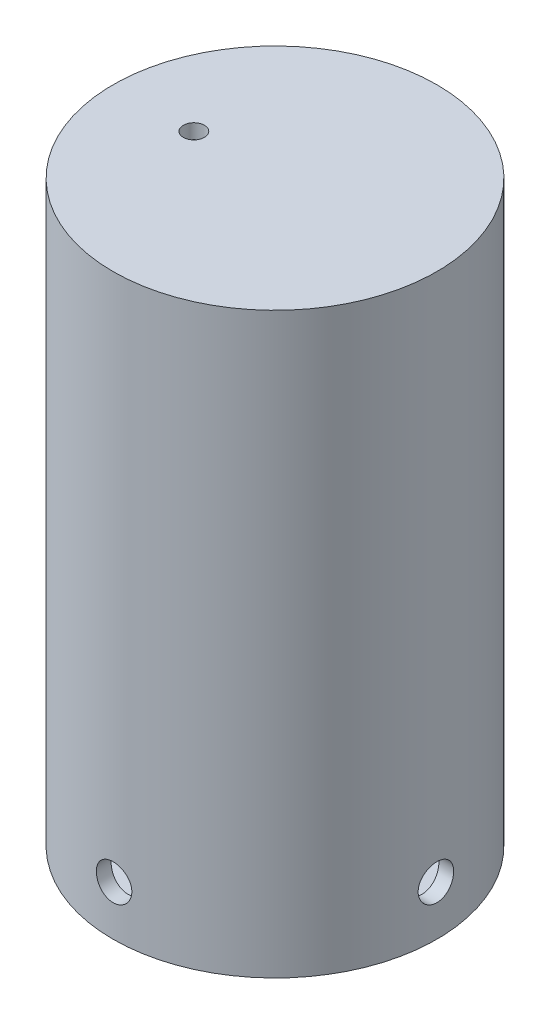
ISO-10303-21;
HEADER;
FILE_DESCRIPTION(('STEP AP214'),'2;1');
FILE_NAME('part.step','',(''),(''),'','','');
FILE_SCHEMA(('AUTOMOTIVE_DESIGN { 1 0 10303 214 1 1 1 1 }'));
ENDSEC;
DATA;
#1=APPLICATION_CONTEXT('core data for automotive mechanical design processes');
#2=APPLICATION_PROTOCOL_DEFINITION('international standard','automotive_design',2000,#1);
#3=PRODUCT_CONTEXT('',#1,'mechanical');
#4=PRODUCT('Part','Part','',(#3));
#5=PRODUCT_RELATED_PRODUCT_CATEGORY('part','',(#4));
#6=PRODUCT_DEFINITION_FORMATION('','',#4);
#7=PRODUCT_DEFINITION_CONTEXT('part definition',#1,'design');
#8=PRODUCT_DEFINITION('design','',#6,#7);
#9=PRODUCT_DEFINITION_SHAPE('','',#8);
#10=(LENGTH_UNIT() NAMED_UNIT(*) SI_UNIT(.MILLI.,.METRE.));
#11=(NAMED_UNIT(*) PLANE_ANGLE_UNIT() SI_UNIT($,.RADIAN.));
#12=(NAMED_UNIT(*) SI_UNIT($,.STERADIAN.) SOLID_ANGLE_UNIT());
#13=UNCERTAINTY_MEASURE_WITH_UNIT(LENGTH_MEASURE(1.E-05),#10,'distance_accuracy_value','');
#14=(GEOMETRIC_REPRESENTATION_CONTEXT(3) GLOBAL_UNCERTAINTY_ASSIGNED_CONTEXT((#13)) GLOBAL_UNIT_ASSIGNED_CONTEXT((#10,
#11,#12)) REPRESENTATION_CONTEXT('',''));
#15=CARTESIAN_POINT('',(0.,0.,0.));
#16=DIRECTION('',(0.,0.,1.));
#17=DIRECTION('',(1.,0.,0.));
#18=AXIS2_PLACEMENT_3D('',#15,#16,#17);
#19=CARTESIAN_POINT('',(0.,236.823029237408,0.));
#20=DIRECTION('',(0.,-1.,0.));
#21=DIRECTION('',(0.,0.,-1.));
#22=AXIS2_PLACEMENT_3D('',#19,#20,#21);
#23=CYLINDRICAL_SURFACE('',#22,69.85);
#24=CARTESIAN_POINT('',(69.4289277202954,15.,7.65809999999998));
#25=CARTESIAN_POINT('',(69.4289270434621,15.2144604520436,7.65810223348373));
#26=CARTESIAN_POINT('',(69.4299234262443,15.4288873007422,7.64908791076217));
#27=CARTESIAN_POINT('',(69.4338791615723,15.8562786698439,7.61309839602858));
#28=CARTESIAN_POINT('',(69.4368389756993,16.0692428344888,7.58611898061445));
#29=CARTESIAN_POINT('',(69.4446408141071,16.492282315416,7.51436350783341));
#30=CARTESIAN_POINT('',(69.4494843040837,16.7023552499056,7.46957359143353));
#31=CARTESIAN_POINT('',(69.4609162052797,17.118031132669,7.36250752797199));
#32=CARTESIAN_POINT('',(69.4675052553256,17.3236324145728,7.30022497859103));
#33=CARTESIAN_POINT('',(69.4822313911915,17.7286241709424,7.15870602887133));
#34=CARTESIAN_POINT('',(69.4903669142035,17.928020681007,7.07948673418331));
#35=CARTESIAN_POINT('',(69.5079619048904,18.3194905790834,6.90459655723254));
#36=CARTESIAN_POINT('',(69.5174218598736,18.511561238391,6.80891961660787));
#37=CARTESIAN_POINT('',(69.5373894199284,18.8868522726023,6.60187677937705));
#38=CARTESIAN_POINT('',(69.5478964319363,19.0700775712789,6.49051974953493));
#39=CARTESIAN_POINT('',(69.5696700124328,19.4265850587656,6.25281994607424));
#40=CARTESIAN_POINT('',(69.5809368610892,19.5998635358931,6.12647163166581));
#41=CARTESIAN_POINT('',(69.603949775463,19.9357880337514,5.85924203684413));
#42=CARTESIAN_POINT('',(69.6156973803895,20.0983947191594,5.71831143989515));
#43=CARTESIAN_POINT('',(69.6393069858754,20.4112305593162,5.42322162124387));
#44=CARTESIAN_POINT('',(69.6511690271228,20.5614551156949,5.26905752800038));
#45=CARTESIAN_POINT('',(69.6746666596345,20.848385904313,4.94864819976145));
#46=CARTESIAN_POINT('',(69.6863022831771,20.9850940749604,4.78240470304402));
#47=CARTESIAN_POINT('',(69.709020868371,21.2440554850344,4.43897716082483));
#48=CARTESIAN_POINT('',(69.7201038220237,21.3663085152911,4.26179295706454));
#49=CARTESIAN_POINT('',(69.7414311344358,21.5957790852908,3.89726751373569));
#50=CARTESIAN_POINT('',(69.7516733109254,21.7029579832252,3.70990181782349));
#51=CARTESIAN_POINT('',(69.7709974497138,21.901145758722,3.32674111885872));
#52=CARTESIAN_POINT('',(69.7800793823589,21.9921542230215,3.13094590053421));
#53=CARTESIAN_POINT('',(69.7968228347225,22.1573197925404,2.73236097571686));
#54=CARTESIAN_POINT('',(69.8044846503862,22.2314804094955,2.52957273700554));
#55=CARTESIAN_POINT('',(69.8181744343044,22.3624536839099,2.11833755930318));
#56=CARTESIAN_POINT('',(69.8242018389196,22.4192603575787,1.90988869539551));
#57=CARTESIAN_POINT('',(69.834425633276,22.5148686721664,1.48978384630326));
#58=CARTESIAN_POINT('',(69.8386296414752,22.5537452719906,1.27814510427997));
#59=CARTESIAN_POINT('',(69.8451243815865,22.6135590506309,0.852315415181941));
#60=CARTESIAN_POINT('',(69.8474150915054,22.6344960232327,0.638124438798187));
#61=CARTESIAN_POINT('',(69.850018041248,22.6582737167127,0.208738077268158));
#62=CARTESIAN_POINT('',(69.8503303707985,22.6611152582866,-0.00645726188350137));
#63=CARTESIAN_POINT('',(69.8489679329253,22.6486832052075,-0.436321968923963));
#64=CARTESIAN_POINT('',(69.8472931259629,22.6334092501055,-0.650991326261996));
#65=CARTESIAN_POINT('',(69.8420157142648,22.5849673626873,-1.07730166365043));
#66=CARTESIAN_POINT('',(69.8384217908958,22.5518800060627,-1.28895190870451));
#67=CARTESIAN_POINT('',(69.8294115299476,22.4680949265527,-1.70876980528173));
#68=CARTESIAN_POINT('',(69.8239945648023,22.4173911391703,-1.91693623159176));
#69=CARTESIAN_POINT('',(69.8114914116313,22.2987539502242,-2.32818522370584));
#70=CARTESIAN_POINT('',(69.8044058034348,22.230826532992,-2.53126952841566));
#71=CARTESIAN_POINT('',(69.7887653119219,22.0782406783679,-2.93101735893844));
#72=CARTESIAN_POINT('',(69.7802098848948,21.993576047845,-3.12767847655222));
#73=CARTESIAN_POINT('',(69.7526526445306,21.7149793095804,-3.70658135334386));
#74=CARTESIAN_POINT('',(69.7317735906362,21.4965680234621,-4.07731529810034));
#75=CARTESIAN_POINT('',(69.6873609694082,21.0010743068951,-4.77677520531394));
#76=CARTESIAN_POINT('',(69.6638273084237,20.7239898062343,-5.10549968486241));
#77=CARTESIAN_POINT('',(69.6165909712192,20.1171770543665,-5.71370025335515));
#78=CARTESIAN_POINT('',(69.5928880570557,19.7871795906618,-5.99290822975302));
#79=CARTESIAN_POINT('',(69.5481095043045,19.0848655312556,-6.49199456501624));
#80=CARTESIAN_POINT('',(69.5270338709065,18.7125488519651,-6.71187280669034));
#81=CARTESIAN_POINT('',(69.4898946538957,17.9359396089532,-7.08608297040378));
#82=CARTESIAN_POINT('',(69.4738324733415,17.5316381336167,-7.24039654795707));
#83=CARTESIAN_POINT('',(69.4485674307796,16.7026477869771,-7.47886991418437));
#84=CARTESIAN_POINT('',(69.4393643164841,16.2779596661402,-7.5630322831495));
#85=CARTESIAN_POINT('',(69.4289040472749,15.4226126318162,-7.65846702781937));
#86=CARTESIAN_POINT('',(69.4276058692269,14.9919961878394,-7.67011572456032));
#87=CARTESIAN_POINT('',(69.4329942016899,14.1349435984943,-7.62118076408312));
#88=CARTESIAN_POINT('',(69.4396805820559,13.7085073851043,-7.56059828420283));
#89=CARTESIAN_POINT('',(69.460247045895,12.873031267954,-7.36924114998446));
#90=CARTESIAN_POINT('',(69.4741087333269,12.4639497583531,-7.23864596370886));
#91=CARTESIAN_POINT('',(69.5074499607478,11.6734877260949,-6.9111364794826));
#92=CARTESIAN_POINT('',(69.526929654425,11.292107961615,-6.71422036720528));
#93=CARTESIAN_POINT('',(69.5694075866074,10.5662079164375,-6.25878877107983));
#94=CARTESIAN_POINT('',(69.5924198667017,10.2218444923134,-6.00002505772089));
#95=CARTESIAN_POINT('',(69.6393375339372,9.58118285906374,-5.42834889606537));
#96=CARTESIAN_POINT('',(69.6632429476797,9.28488608297278,-5.11543483393237));
#97=CARTESIAN_POINT('',(69.697795924219,8.88241948957306,-4.61176829554837));
#98=CARTESIAN_POINT('',(69.7091247982431,8.75497424764493,-4.43764782481234));
#99=CARTESIAN_POINT('',(69.7310135837692,8.51521136073353,-4.07926523413445));
#100=CARTESIAN_POINT('',(69.7415737777516,8.40288814556836,-3.89500688389393));
#101=CARTESIAN_POINT('',(69.7616294892296,8.1941381493722,-3.5175688037617));
#102=CARTESIAN_POINT('',(69.7711246203785,8.09771713086286,-3.32438587216539));
#103=CARTESIAN_POINT('',(69.7887739243149,7.92153667147838,-2.93058960416694));
#104=CARTESIAN_POINT('',(69.7969286001888,7.84177097664071,-2.72997909020582));
#105=CARTESIAN_POINT('',(69.8116560578932,7.69956751300371,-2.32304870553661));
#106=CARTESIAN_POINT('',(69.8182315981732,7.63709949879104,-2.11673950295596));
#107=CARTESIAN_POINT('',(69.8296306036983,7.52978215101868,-1.6996177203336));
#108=CARTESIAN_POINT('',(69.834454685534,7.48492661663603,-1.48880675283865));
#109=CARTESIAN_POINT('',(69.842217427731,7.41312930096823,-1.06408716846374));
#110=CARTESIAN_POINT('',(69.845155789786,7.38619035392472,-0.850178066953119));
#111=CARTESIAN_POINT('',(69.8490621266856,7.35043840199638,-0.420837552728924));
#112=CARTESIAN_POINT('',(69.8500301522632,7.34162493040894,-0.205406179354786));
#113=CARTESIAN_POINT('',(69.8499685739818,7.34218668733865,0.224304427499888));
#114=CARTESIAN_POINT('',(69.848949393657,7.35146700807971,0.438583792663247));
#115=CARTESIAN_POINT('',(69.8449629099931,7.38795904662506,0.8655884736391));
#116=CARTESIAN_POINT('',(69.8419956380555,7.41517047539688,1.07831381444511));
#117=CARTESIAN_POINT('',(69.8341959343983,7.48733057225109,1.50073791540644));
#118=CARTESIAN_POINT('',(69.8293631741236,7.53228236484811,1.71043613566375));
#119=CARTESIAN_POINT('',(69.8179705498948,7.63957551721812,2.1252103255704));
#120=CARTESIAN_POINT('',(69.8114112773734,7.70191092250887,2.33028785201459));
#121=CARTESIAN_POINT('',(69.7967492599359,7.843523326445,2.73444426219448));
#122=CARTESIAN_POINT('',(69.7886465538093,7.92279989933172,2.93352329653846));
#123=CARTESIAN_POINT('',(69.771124865078,8.09772296695365,3.32428794286159));
#124=CARTESIAN_POINT('',(69.7617059141344,8.19336906794436,3.51597373253832));
#125=CARTESIAN_POINT('',(69.7418149151283,8.40035232396542,3.89062307856889));
#126=CARTESIAN_POINT('',(69.7313428531575,8.51168968623381,4.07358651968198));
#127=CARTESIAN_POINT('',(69.7096383726225,8.74926687851716,4.42951613727999));
#128=CARTESIAN_POINT('',(69.6984059620493,8.87550655192145,4.60248241879814));
#129=CARTESIAN_POINT('',(69.6754340797205,9.1427043143583,4.93809999773259));
#130=CARTESIAN_POINT('',(69.6636922600588,9.28373603826864,5.10069251656115));
#131=CARTESIAN_POINT('',(69.6400924303206,9.57892085357925,5.41337286925155));
#132=CARTESIAN_POINT('',(69.6282344641013,9.73306914924849,5.56346523408804));
#133=CARTESIAN_POINT('',(69.60472556669,10.0535503445871,5.85024761900639));
#134=CARTESIAN_POINT('',(69.5930747655727,10.2198905854227,5.98692944640393));
#135=CARTESIAN_POINT('',(69.5703216975128,10.5634452899078,6.24577609485257));
#136=CARTESIAN_POINT('',(69.5592192296136,10.7406557155939,6.36794625764198));
#137=CARTESIAN_POINT('',(69.5378371604055,11.1053833369294,6.59734987581297));
#138=CARTESIAN_POINT('',(69.5275604700999,11.2929333741027,6.70453139893041));
#139=CARTESIAN_POINT('',(69.5081702310998,11.6763914051992,6.90265745056741));
#140=CARTESIAN_POINT('',(69.4990562565075,11.8722963034842,6.99360792934723));
#141=CARTESIAN_POINT('',(69.4822561456945,12.2709828111839,7.15859341715195));
#142=CARTESIAN_POINT('',(69.4745688601458,12.4737587282483,7.23264205330604));
#143=CARTESIAN_POINT('',(69.4608363035014,12.8848201086546,7.36335712530642));
#144=CARTESIAN_POINT('',(69.4547906347164,13.0931042241683,7.42002777148288));
#145=CARTESIAN_POINT('',(69.4428636051821,13.581411745008,7.53095617492524));
#146=CARTESIAN_POINT('',(69.4376591789338,13.8629826532104,7.57858810527203));
#147=CARTESIAN_POINT('',(69.4306916955442,14.4297221835823,7.64215844887917));
#148=CARTESIAN_POINT('',(69.4289286200948,14.7148907866036,7.65809703074953));
#149=CARTESIAN_POINT('',(69.4289277202954,15.,7.65809999999998));
#150=B_SPLINE_CURVE_WITH_KNOTS('',3,(#24,#25,#26,#27,#28,#29,#30,#31,#32,#33,#34,#35,#36,#37,
#38,#39,#40,#41,#42,#43,#44,#45,#46,#47,#48,#49,#50,#51,#52,#53,#54,#55,#56,#57,#58,#59,#60,#61,
#62,#63,#64,#65,#66,#67,#68,#69,#70,#71,#72,#73,#74,#75,#76,#77,#78,#79,#80,#81,#82,#83,#84,#85,
#86,#87,#88,#89,#90,#91,#92,#93,#94,#95,#96,#97,#98,#99,#100,#101,#102,#103,#104,#105,#106,#107,
#108,#109,#110,#111,#112,#113,#114,#115,#116,#117,#118,#119,#120,#121,#122,#123,#124,#125,#126,
#127,#128,#129,#130,#131,#132,#133,#134,#135,#136,#137,#138,#139,#140,#141,#142,#143,#144,#145,
#146,#147,#148,#149),.UNSPECIFIED.,.T.,.F.,(4,2,2,2,2,2,2,2,2,2,2,2,2,2,2,2,2,2,2,2,2,2,2,2,2,2,
2,2,2,2,2,2,2,2,2,2,2,2,2,2,2,2,2,2,2,2,2,2,2,2,2,2,2,2,2,2,2,2,2,2,2,2,4),(0.,
0.643131946374755,1.28641513963007,1.93019987879461,2.57422055149428,3.2175938279258,
3.86120445072411,4.50445257589176,5.14793919099909,5.79367795841491,6.43965546434627,
7.08554019474696,7.73143427013144,8.37895500885917,9.02649229369903,9.67389448291172,
10.3215196507213,10.9664122356076,11.6113122333754,12.2561829823034,12.9010665626179,
13.5430573406193,14.1852693447653,14.8272585180792,15.469485687418,16.7552585677177,
18.0410768224911,19.3336577736681,20.6262412780011,21.9191861994254,23.2120835618468,
24.498265598977,25.7844266721666,27.0673065007387,28.3502214276167,29.6383745398378,
30.9265660493466,31.5741601343839,32.2215150223622,32.8691039810764,33.5164493354394,
34.1626555387187,34.8086340278471,35.4547146806242,36.1007786976278,36.743463016236,
37.3861369756354,38.0289241762844,38.6714914701888,39.3140426172475,39.9565783108724,
40.5991224914068,41.2416599199467,41.8875631230839,42.5332311751026,43.1792912502774,
43.8251127691289,44.4731192326039,45.1208876483372,45.7681319406348,46.4152192948064,
47.270219911936,48.1252159804125),.UNSPECIFIED.);
#151=CARTESIAN_POINT('',(69.4289277202954,15.,7.65809999999998));
#152=VERTEX_POINT('',#151);
#153=EDGE_CURVE('E185',#152,#152,#150,.T.);
#154=ORIENTED_EDGE('',*,*,#153,.T.);
#155=EDGE_LOOP('',(#154));
#156=FACE_BOUND('',#155,.T.);
#157=CARTESIAN_POINT('',(0.,7.34190000000001,69.85));
#158=CARTESIAN_POINT('',(-0.214464809033726,7.34189776713259,69.8500006620498));
#159=CARTESIAN_POINT('',(-0.428896014007771,7.35091245263155,69.8490102958909));
#160=CARTESIAN_POINT('',(-0.856296212645893,7.38690345151595,69.8450779144871));
#161=CARTESIAN_POINT('',(-1.06926485063329,7.41388398785686,69.8421354403908));
#162=CARTESIAN_POINT('',(-1.49231337748228,7.48564252755423,69.8343776785917));
#163=CARTESIAN_POINT('',(-1.70239088580209,7.53043438410181,69.8295609331912));
#164=CARTESIAN_POINT('',(-2.1180760115525,7.63750523539137,69.8181888972035));
#165=CARTESIAN_POINT('',(-2.32368196288061,7.69979063190491,69.8116329702107));
#166=CARTESIAN_POINT('',(-2.72868365066121,7.84131645780487,69.7969756531012));
#167=CARTESIAN_POINT('',(-2.92808540221923,7.9205398389555,69.7888758178249));
#168=CARTESIAN_POINT('',(-3.31956532837102,8.09543918012614,69.7713508241457));
#169=CARTESIAN_POINT('',(-3.51164077418457,8.19112119866997,69.7619251779374));
#170=CARTESIAN_POINT('',(-3.88694051826329,8.39817496770262,69.7420209844232));
#171=CARTESIAN_POINT('',(-4.07016974353815,8.50953784595345,69.7315430334666));
#172=CARTESIAN_POINT('',(-4.42668399437505,8.74724988229208,69.7098191105082));
#173=CARTESIAN_POINT('',(-4.59996530792319,8.87360458125934,69.6985728552016));
#174=CARTESIAN_POINT('',(-4.93588584769755,9.14084054117102,69.6755909741012));
#175=CARTESIAN_POINT('',(-5.0984862947531,9.28177041653453,69.6638537937859));
#176=CARTESIAN_POINT('',(-5.41130960834261,9.57685747219917,69.6402530734786));
#177=CARTESIAN_POINT('',(-5.56152787656161,9.73101952347744,69.6283894883747));
#178=CARTESIAN_POINT('',(-5.84844636938757,10.0514235205885,69.6048769672123));
#179=CARTESIAN_POINT('',(-5.98514852365231,10.2176637361593,69.5932280007071));
#180=CARTESIAN_POINT('',(-6.24409838062129,10.5610834967638,69.57047243932));
#181=CARTESIAN_POINT('',(-6.36634587347101,10.7382632005613,69.5593658523138));
#182=CARTESIAN_POINT('',(-6.59581020849148,11.102785123736,69.5379831872196));
#183=CARTESIAN_POINT('',(-6.70298786540348,11.2901521421934,69.5277093026743));
#184=CARTESIAN_POINT('',(-6.90117302005957,11.6733153990981,69.5083177068893));
#185=CARTESIAN_POINT('',(-6.99218010424166,11.8691118529689,69.4992000252213));
#186=CARTESIAN_POINT('',(-7.15734281792687,12.2676992947776,69.4823850906111));
#187=CARTESIAN_POINT('',(-7.23150196601214,12.4704888120513,69.4746875411468));
#188=CARTESIAN_POINT('',(-7.36247223116627,12.8817268150157,69.4609303440465));
#189=CARTESIAN_POINT('',(-7.41927736496853,13.0901772255413,69.4548712613988));
#190=CARTESIAN_POINT('',(-7.51488264040345,13.5102863060125,69.4445918943391));
#191=CARTESIAN_POINT('',(-7.55375767101014,13.7219277477435,69.4403639663107));
#192=CARTESIAN_POINT('',(-7.61356790343426,14.1477630355457,69.4338317466849));
#193=CARTESIAN_POINT('',(-7.63450290004143,14.3619569107849,69.4315274770915));
#194=CARTESIAN_POINT('',(-7.65827616301662,14.7913489480978,69.4289093251359));
#195=CARTESIAN_POINT('',(-7.66111525798645,15.0065470637363,69.428595351639));
#196=CARTESIAN_POINT('',(-7.64867785868408,15.4364170034144,69.4299666268241));
#197=CARTESIAN_POINT('',(-7.63340100489304,15.6510888169245,69.4316519151823));
#198=CARTESIAN_POINT('',(-7.58495481328114,16.07738727812,69.4369609756454));
#199=CARTESIAN_POINT('',(-7.55186741115112,16.2890233496679,69.4405758701545));
#200=CARTESIAN_POINT('',(-7.46808467529419,16.7088128319448,69.4496363095504));
#201=CARTESIAN_POINT('',(-7.41738327823427,16.9169650175064,69.4550824848053));
#202=CARTESIAN_POINT('',(-7.29875330759042,17.3281859161624,69.4676490038429));
#203=CARTESIAN_POINT('',(-7.2308307061862,17.531256364795,69.474768767176));
#204=CARTESIAN_POINT('',(-7.07825687382712,17.9309771643091,69.4904787323774));
#205=CARTESIAN_POINT('',(-6.9935994500227,18.127625107008,69.4990694784362));
#206=CARTESIAN_POINT('',(-6.71501959887103,18.7065070975429,69.5267292241925));
#207=CARTESIAN_POINT('',(-6.49661854326067,19.0772337111604,69.5476713408257));
#208=CARTESIAN_POINT('',(-6.00114669072514,19.7766833099272,69.5921714946867));
#209=CARTESIAN_POINT('',(-5.72407382844071,20.1054048157634,69.6157296239894));
#210=CARTESIAN_POINT('',(-5.11726936573294,20.713618431475,69.6629668019214));
#211=CARTESIAN_POINT('',(-4.78726616720717,20.9928400845395,69.6866458289239));
#212=CARTESIAN_POINT('',(-4.08493574922228,21.4919512871352,69.7313373484066));
#213=CARTESIAN_POINT('',(-3.71260846652766,21.7118407480179,69.7523498369027));
#214=CARTESIAN_POINT('',(-2.93599628187859,22.0860589957336,69.7893502201972));
#215=CARTESIAN_POINT('',(-2.53170414538824,22.2403728903221,69.8053369734343));
#216=CARTESIAN_POINT('',(-1.70273410822608,22.4788497493811,69.8304733787469));
#217=CARTESIAN_POINT('',(-1.27805694137495,22.5630152370552,69.8396232767395));
#218=CARTESIAN_POINT('',(-0.422715111888178,22.6584617530284,69.8500233676986));
#219=CARTESIAN_POINT('',(0.00790741076035084,22.670116188124,69.8513140322604));
#220=CARTESIAN_POINT('',(0.864973533434724,22.6211905348983,69.8459589506359));
#221=CARTESIAN_POINT('',(1.29141720143552,22.5606116235271,69.8393133337612));
#222=CARTESIAN_POINT('',(2.1269309569693,22.3692537253834,69.8188582723942));
#223=CARTESIAN_POINT('',(2.53604183610578,22.238650723469,69.805066789832));
#224=CARTESIAN_POINT('',(3.32655915295766,21.91111577925,69.7718650781837));
#225=CARTESIAN_POINT('',(3.70796485184065,21.7141820688494,69.7524546993234));
#226=CARTESIAN_POINT('',(4.43388274811554,21.2587244666071,69.7100862266784));
#227=CARTESIAN_POINT('',(4.77824089943499,20.9999568097792,69.6871142212171));
#228=CARTESIAN_POINT('',(5.41889005311162,20.4282758952685,69.6402288254582));
#229=CARTESIAN_POINT('',(5.71517959913058,20.115360997676,69.6163154066659));
#230=CARTESIAN_POINT('',(6.1176345079626,19.6116965030485,69.5817171629715));
#231=CARTESIAN_POINT('',(6.24507553369868,19.4375775771443,69.5703675725981));
#232=CARTESIAN_POINT('',(6.4848302415704,19.0791988935373,69.5484287813486));
#233=CARTESIAN_POINT('',(6.59714949357414,18.894942905083,69.5378393011726));
#234=CARTESIAN_POINT('',(6.80589206174175,18.5175100984925,69.5177196574241));
#235=CARTESIAN_POINT('',(6.90230961444188,18.3243300782327,69.5081898783391));
#236=CARTESIAN_POINT('',(7.0784837874771,17.9305398888992,69.49046988447));
#237=CARTESIAN_POINT('',(7.15824666176163,17.7299325422744,69.4822791671104));
#238=CARTESIAN_POINT('',(7.30044805351432,17.3230002397563,69.4674820673995));
#239=CARTESIAN_POINT('',(7.36291612227844,17.1166857076337,69.4608729851933));
#240=CARTESIAN_POINT('',(7.47023277659723,16.6995527794494,69.4494135084525));
#241=CARTESIAN_POINT('',(7.51508756430243,16.4887359963828,69.4445624948971));
#242=CARTESIAN_POINT('',(7.58688243982848,16.0640045771089,69.4367555516879));
#243=CARTESIAN_POINT('',(7.61381970584286,15.8500894583666,69.433799920538));
#244=CARTESIAN_POINT('',(7.64956730168647,15.4207368470094,69.4298706958628));
#245=CARTESIAN_POINT('',(7.65837809950842,15.2052993938426,69.4288970511662));
#246=CARTESIAN_POINT('',(7.65781002333923,14.7755923653559,69.4289596995188));
#247=CARTESIAN_POINT('',(7.64852735719934,14.5613226550112,69.4299853617131));
#248=CARTESIAN_POINT('',(7.61203227079535,14.1343375578034,69.4339960008162));
#249=CARTESIAN_POINT('',(7.58482013939226,13.9216221459548,69.4369809461591));
#250=CARTESIAN_POINT('',(7.51266034940573,13.4992180428093,69.4448252171475));
#251=CARTESIAN_POINT('',(7.46770955996768,13.2895298925969,69.4496848736742));
#252=CARTESIAN_POINT('',(7.36042019632223,12.8747758578775,69.4611374834701));
#253=CARTESIAN_POINT('',(7.29808757469288,12.6697084169021,69.4677298433139));
#254=CARTESIAN_POINT('',(7.15648279538588,12.2655726514625,69.4824604963064));
#255=CARTESIAN_POINT('',(7.07721112630162,12.0665041541525,69.4905987448643));
#256=CARTESIAN_POINT('',(6.90229968608553,11.6757598425982,69.5081900176569));
#257=CARTESIAN_POINT('',(6.80666030880659,11.4840838506055,69.517643010254));
#258=CARTESIAN_POINT('',(6.59969205932666,11.1094528489057,69.5375967919943));
#259=CARTESIAN_POINT('',(6.48836297446836,10.9264979574488,69.548097595339));
#260=CARTESIAN_POINT('',(6.25080359910064,10.5705838698968,69.5698510490343));
#261=CARTESIAN_POINT('',(6.12457346498887,10.3976245689189,69.5811036914933));
#262=CARTESIAN_POINT('',(5.85738579469752,10.062006673722,69.6041062006998));
#263=CARTESIAN_POINT('',(5.71635357955181,9.89940768536655,69.6158583914337));
#264=CARTESIAN_POINT('',(5.42116644336269,9.58671433431482,69.6394669923727));
#265=CARTESIAN_POINT('',(5.2670163186061,9.43661544060224,69.6513233630768));
#266=CARTESIAN_POINT('',(4.9465301805549,9.14982024468736,69.6748172851212));
#267=CARTESIAN_POINT('',(4.78018683196231,9.01313212779551,69.6864546993618));
#268=CARTESIAN_POINT('',(4.43662467277229,8.75427337503193,69.7091707187145));
#269=CARTESIAN_POINT('',(4.25940990134597,8.63209739626476,69.7202495286166));
#270=CARTESIAN_POINT('',(3.89467910074993,8.40268700598937,69.7415761903504));
#271=CARTESIAN_POINT('',(3.70713057509765,8.29550397845964,69.7518211365179));
#272=CARTESIAN_POINT('',(3.32367545387521,8.09737475994372,69.7711438785328));
#273=CARTESIAN_POINT('',(3.12777195391197,8.0064226188937,69.780222101745));
#274=CARTESIAN_POINT('',(2.72908824303012,7.84143368786581,69.7969507774122));
#275=CARTESIAN_POINT('',(2.52631372073911,7.76738327953096,69.8046023784331));
#276=CARTESIAN_POINT('',(2.11525536054127,7.63666457958418,69.8182676552919));
#277=CARTESIAN_POINT('',(1.90697286990267,7.57999207922126,69.8242817276828));
#278=CARTESIAN_POINT('',(1.41865411281029,7.46905570043709,69.8361447417569));
#279=CARTESIAN_POINT('',(1.13707004666989,7.42141929879114,69.8413194528829));
#280=CARTESIAN_POINT('',(0.570304176538139,7.35784301534287,69.8482466330109));
#281=CARTESIAN_POINT('',(0.285122391286716,7.34190296850801,69.8499991198312));
#282=CARTESIAN_POINT('',(0.,7.34190000000001,69.85));
#283=B_SPLINE_CURVE_WITH_KNOTS('',3,(#157,#158,#159,#160,#161,#162,#163,#164,#165,#166,#167,
#168,#169,#170,#171,#172,#173,#174,#175,#176,#177,#178,#179,#180,#181,#182,#183,#184,#185,#186,
#187,#188,#189,#190,#191,#192,#193,#194,#195,#196,#197,#198,#199,#200,#201,#202,#203,#204,#205,
#206,#207,#208,#209,#210,#211,#212,#213,#214,#215,#216,#217,#218,#219,#220,#221,#222,#223,#224,
#225,#226,#227,#228,#229,#230,#231,#232,#233,#234,#235,#236,#237,#238,#239,#240,#241,#242,#243,
#244,#245,#246,#247,#248,#249,#250,#251,#252,#253,#254,#255,#256,#257,#258,#259,#260,#261,#262,
#263,#264,#265,#266,#267,#268,#269,#270,#271,#272,#273,#274,#275,#276,#277,#278,#279,#280,#281,
#282),.UNSPECIFIED.,.T.,.F.,(4,2,2,2,2,2,2,2,2,2,2,2,2,2,2,2,2,2,2,2,2,2,2,2,2,2,2,2,2,2,2,2,2,
2,2,2,2,2,2,2,2,2,2,2,2,2,2,2,2,2,2,2,2,2,2,2,2,2,2,2,2,2,4),(0.,0.643145030832083,
1.28644128923601,1.93023886879722,2.57427235413715,3.2176606401689,3.86128627012871,
4.50454918885662,5.14805059833251,5.79377216859053,6.43973246725585,7.08560041040771,
7.7314777291972,8.37900460078601,9.02654803047532,9.67395610034806,10.3215871304382,
10.9664881317184,11.6113965097142,12.2562753574829,12.9011670033655,13.5431169311171,
14.1852880590756,14.8272367909634,15.469423527133,16.7551718861904,18.0409655135638,
19.3335813407151,20.6261990991612,21.9191102550818,23.2119749036166,24.4981761988263,
25.7843565373157,27.067319490273,28.3503166443024,29.6384576563975,30.9266376881145,
31.5742239162239,32.221570959688,32.869152116544,33.5164896630381,34.1627141924377,
34.8087109628142,35.4548094462831,36.1008912484448,36.7435470288599,37.3861924557224,
38.0289513595981,38.6714904141709,39.3140109377154,39.9565160025906,40.5990297767773,
41.2415368079007,41.8874572628535,42.5331425570633,43.1792195271814,43.8250578906963,
44.4730581164926,45.1208203023801,45.7680587049941,46.415140229074,47.2701802924886,
48.1252159039776),.UNSPECIFIED.);
#284=CARTESIAN_POINT('',(0.,7.34190000000001,69.85));
#285=VERTEX_POINT('',#284);
#286=EDGE_CURVE('E10',#285,#285,#283,.T.);
#287=ORIENTED_EDGE('',*,*,#286,.T.);
#288=EDGE_LOOP('',(#287));
#289=FACE_BOUND('',#288,.T.);
#290=CARTESIAN_POINT('',(0.,243.173029237408,0.));
#291=DIRECTION('',(0.,1.,0.));
#292=DIRECTION('',(0.,0.,1.));
#293=AXIS2_PLACEMENT_3D('',#290,#291,#292);
#294=CIRCLE('',#293,69.85);
#295=CARTESIAN_POINT('',(0.,243.173029237408,69.85));
#296=VERTEX_POINT('',#295);
#297=EDGE_CURVE('E63',#296,#296,#294,.T.);
#298=ORIENTED_EDGE('',*,*,#297,.F.);
#299=EDGE_LOOP('',(#298));
#300=FACE_BOUND('',#299,.T.);
#301=CARTESIAN_POINT('',(0.,-6.34999999999999,0.));
#302=DIRECTION('',(0.,1.,0.));
#303=DIRECTION('',(0.,0.,1.));
#304=AXIS2_PLACEMENT_3D('',#301,#302,#303);
#305=CIRCLE('',#304,69.85);
#306=CARTESIAN_POINT('',(0.,-6.34999999999999,69.85));
#307=VERTEX_POINT('',#306);
#308=EDGE_CURVE('E65',#307,#307,#305,.T.);
#309=ORIENTED_EDGE('',*,*,#308,.T.);
#310=EDGE_LOOP('',(#309));
#311=FACE_BOUND('',#310,.T.);
#312=ADVANCED_FACE('F39',(#156,#289,#300,#311),#23,.T.);
#313=CARTESIAN_POINT('',(0.,243.173029237408,0.));
#314=DIRECTION('',(0.,1.,0.));
#315=DIRECTION('',(0.,0.,1.));
#316=AXIS2_PLACEMENT_3D('',#313,#314,#315);
#317=PLANE('',#316);
#318=CARTESIAN_POINT('',(-35.,243.173029237408,0.));
#319=DIRECTION('',(0.,1.,0.));
#320=DIRECTION('',(0.,0.,1.));
#321=AXIS2_PLACEMENT_3D('',#318,#319,#320);
#322=CIRCLE('',#321,4.54659999999999);
#323=CARTESIAN_POINT('',(-35.,243.173029237408,4.54659999999999));
#324=VERTEX_POINT('',#323);
#325=EDGE_CURVE('E195',#324,#324,#322,.T.);
#326=ORIENTED_EDGE('',*,*,#325,.F.);
#327=EDGE_LOOP('',(#326));
#328=FACE_BOUND('',#327,.T.);
#329=ORIENTED_EDGE('',*,*,#297,.T.);
#330=EDGE_LOOP('',(#329));
#331=FACE_BOUND('',#330,.T.);
#332=ADVANCED_FACE('F97',(#328,#331),#317,.T.);
#333=CARTESIAN_POINT('',(0.,-6.35,0.));
#334=DIRECTION('',(0.,1.,0.));
#335=DIRECTION('',(0.,0.,1.));
#336=AXIS2_PLACEMENT_3D('',#333,#334,#335);
#337=PLANE('',#336);
#338=ORIENTED_EDGE('',*,*,#308,.F.);
#339=EDGE_LOOP('',(#338));
#340=FACE_BOUND('',#339,.T.);
#341=ADVANCED_FACE('F89',(#340),#337,.F.);
#342=CARTESIAN_POINT('',(0.,15.,0.));
#343=DIRECTION('',(0.,0.,-1.));
#344=DIRECTION('',(-1.,0.,0.));
#345=AXIS2_PLACEMENT_3D('',#342,#343,#344);
#346=CYLINDRICAL_SURFACE('',#345,7.65809999999999);
#347=CARTESIAN_POINT('',(-7.65809999999999,15.,63.0365251611318));
#348=CARTESIAN_POINT('',(-7.65810239117939,15.2143139155312,63.03652436521));
#349=CARTESIAN_POINT('',(-7.64910030291699,15.4285924828744,63.0376203253321));
#350=CARTESIAN_POINT('',(-7.61316069122692,15.855686217949,63.0419711609916));
#351=CARTESIAN_POINT('',(-7.58621905615378,16.068501038898,63.0452265314533));
#352=CARTESIAN_POINT('',(-7.51456668135552,16.491235780768,63.0538070496965));
#353=CARTESIAN_POINT('',(-7.46984252088624,16.7011533910237,63.0591337606835));
#354=CARTESIAN_POINT('',(-7.36293728756388,17.1165194077849,63.0717056211209));
#355=CARTESIAN_POINT('',(-7.30074982028365,17.3219661474737,63.0789514732356));
#356=CARTESIAN_POINT('',(-7.15945421996129,17.7266457015153,63.0951445177018));
#357=CARTESIAN_POINT('',(-7.08036373351137,17.925884749975,63.1040899346508));
#358=CARTESIAN_POINT('',(-6.9057640637473,18.317048189356,63.123435705524));
#359=CARTESIAN_POINT('',(-6.81024883335927,18.5089698543393,63.133836595044));
#360=CARTESIAN_POINT('',(-6.60356057887715,18.8839794560361,63.1557897290831));
#361=CARTESIAN_POINT('',(-6.49239622712441,19.0670722105624,63.167341334875));
#362=CARTESIAN_POINT('',(-6.25511183167599,19.4233353613598,63.1912794169041));
#363=CARTESIAN_POINT('',(-6.12898625314358,19.5965020501694,63.2036662013756));
#364=CARTESIAN_POINT('',(-5.86212344719774,19.9323631202779,63.2289770851892));
#365=CARTESIAN_POINT('',(-5.72132582521535,20.095009360272,63.2419032626581));
#366=CARTESIAN_POINT('',(-5.42650266854051,20.4079379556135,63.2678826033954));
#367=CARTESIAN_POINT('',(-5.27247226134995,20.5582157164872,63.280935811856));
#368=CARTESIAN_POINT('',(-4.95232616062756,20.8452697011779,63.3067946258739));
#369=CARTESIAN_POINT('',(-4.78621218041627,20.9820478326405,63.3196002662092));
#370=CARTESIAN_POINT('',(-4.44303491809634,21.2411669832173,63.3446054037368));
#371=CARTESIAN_POINT('',(-4.2659714799922,21.3635077965726,63.3568048922889));
#372=CARTESIAN_POINT('',(-3.90157482187099,21.5932344744558,63.3802898656327));
#373=CARTESIAN_POINT('',(-3.71421180090746,21.7005733742468,63.3915724357504));
#374=CARTESIAN_POINT('',(-3.33102988588719,21.8990792689154,63.4128619093257));
#375=CARTESIAN_POINT('',(-3.1352107719617,21.9902458429776,63.4228687795867));
#376=CARTESIAN_POINT('',(-2.73655192070409,22.155721261583,63.4413200324));
#377=CARTESIAN_POINT('',(-2.53371368959839,22.230033697302,63.4497647477357));
#378=CARTESIAN_POINT('',(-2.12235278457736,22.3613002867167,63.4648563366383));
#379=CARTESIAN_POINT('',(-1.91382817905281,22.4182484598548,63.471502590695));
#380=CARTESIAN_POINT('',(-1.49372661418512,22.5140840425515,63.4827748933193));
#381=CARTESIAN_POINT('',(-1.28217043312097,22.5530613624886,63.4874109918357));
#382=CARTESIAN_POINT('',(-0.856491491456721,22.6130886965197,63.4945803501359));
#383=CARTESIAN_POINT('',(-0.642368703591328,22.634138519997,63.4971135875608));
#384=CARTESIAN_POINT('',(-0.213107478873325,22.6581517905276,63.5000051218908));
#385=CARTESIAN_POINT('',(0.0020309061852732,22.6611161501513,63.5003635285353));
#386=CARTESIAN_POINT('',(0.431791340909593,22.6489387386451,63.498895517563));
#387=CARTESIAN_POINT('',(0.6464133804619,22.633796615719,63.4970690574958));
#388=CARTESIAN_POINT('',(1.07244363070245,22.5856486559056,63.4912986456066));
#389=CARTESIAN_POINT('',(1.28386292644378,22.5527394990459,63.4873661547571));
#390=CARTESIAN_POINT('',(1.70323197895893,22.4693524483812,63.4775001037454));
#391=CARTESIAN_POINT('',(1.91118051627606,22.4188685103753,63.4715658551741));
#392=CARTESIAN_POINT('',(2.32201074344795,22.3007128091004,63.4578637181258));
#393=CARTESIAN_POINT('',(2.52489415768143,22.233046985374,63.4500964633595));
#394=CARTESIAN_POINT('',(2.92426177114597,22.0810258858276,63.4329469259926));
#395=CARTESIAN_POINT('',(3.12074356824262,21.9966644272791,63.423564045261));
#396=CARTESIAN_POINT('',(3.69930983216224,21.7189625421963,63.3933264752562));
#397=CARTESIAN_POINT('',(4.0699142943484,21.5011779601903,63.3704040147649));
#398=CARTESIAN_POINT('',(4.76924848921746,21.0070266971633,63.3216209963001));
#399=CARTESIAN_POINT('',(5.097976432937,20.7306575147529,63.2957603128951));
#400=CARTESIAN_POINT('',(5.70669756756453,20.1249865468001,63.2437948646994));
#401=CARTESIAN_POINT('',(5.98636736946069,19.7953591590542,63.2176895938288));
#402=CARTESIAN_POINT('',(6.48644458171286,19.0936759106767,63.1683419214885));
#403=CARTESIAN_POINT('',(6.70685182869719,18.7216199330844,63.1450995279112));
#404=CARTESIAN_POINT('',(7.08218221580297,17.9453525857753,63.104108549813));
#405=CARTESIAN_POINT('',(7.23708056268958,17.541129110233,63.0863620460074));
#406=CARTESIAN_POINT('',(7.47670949683192,16.7121478059436,63.0584134399294));
#407=CARTESIAN_POINT('',(7.56144322426306,16.2873908970585,63.0482110000291));
#408=CARTESIAN_POINT('',(7.65791302612808,15.4322558816058,63.0365668079862));
#409=CARTESIAN_POINT('',(7.6701042168367,15.0019298328848,63.035070437159));
#410=CARTESIAN_POINT('',(7.62234098520902,14.1453672981036,63.0408635079002));
#411=CARTESIAN_POINT('',(7.56238799175104,13.7191307312162,63.0481527754614));
#412=CARTESIAN_POINT('',(7.37242584770784,12.8842062528882,63.0706457294398));
#413=CARTESIAN_POINT('',(7.24263606815632,12.4754676939411,63.085824627929));
#414=CARTESIAN_POINT('',(6.91689231710139,11.6855479469992,63.1223674838684));
#415=CARTESIAN_POINT('',(6.72093617374541,11.3043676640793,63.1437316443411));
#416=CARTESIAN_POINT('',(6.26736533923379,10.5783660586276,63.1903651941275));
#417=CARTESIAN_POINT('',(6.00945184799997,10.2337329723546,63.215653291364));
#418=CARTESIAN_POINT('',(5.43946305876735,9.59236266998567,63.2672402063115));
#419=CARTESIAN_POINT('',(5.12738580232998,9.29562718650723,63.2935390605424));
#420=CARTESIAN_POINT('',(4.62476174916087,8.89223448377569,63.3315891741756));
#421=CARTESIAN_POINT('',(4.45086476631458,8.76438500759527,63.3440767118709));
#422=CARTESIAN_POINT('',(4.09288480622894,8.52379664331831,63.3682129181793));
#423=CARTESIAN_POINT('',(3.90880561524455,8.41105219107952,63.3798618949521));
#424=CARTESIAN_POINT('',(3.53168016290997,8.20144789864304,63.401994738628));
#425=CARTESIAN_POINT('',(3.33863079669186,8.10459361190034,63.4124781977834));
#426=CARTESIAN_POINT('',(2.94504691444694,7.92753694160419,63.4319753444821));
#427=CARTESIAN_POINT('',(2.74451507457821,7.84732867057795,63.4409895514373));
#428=CARTESIAN_POINT('',(2.3378087328167,7.70428154370529,63.4572767288986));
#429=CARTESIAN_POINT('',(2.13164851970867,7.64140251638473,63.4645537211636));
#430=CARTESIAN_POINT('',(1.71471114226131,7.53323071611678,63.4771869213497));
#431=CARTESIAN_POINT('',(1.50393408473845,7.48793753675189,63.4825431736599));
#432=CARTESIAN_POINT('',(1.07927417405462,7.41527414480973,63.4911825931373));
#433=CARTESIAN_POINT('',(0.865391371797683,7.38790363881289,63.4944657942432));
#434=CARTESIAN_POINT('',(0.436061239448366,7.35129023763264,63.4988656098147));
#435=CARTESIAN_POINT('',(0.220613940602049,7.34204698140647,63.4999822674317));
#436=CARTESIAN_POINT('',(-0.208962180165914,7.34175739315644,63.5000172049553));
#437=CARTESIAN_POINT('',(-0.423090933937288,7.35059912030103,63.4989490084797));
#438=CARTESIAN_POINT('',(-0.84975903654335,7.38618249698685,63.4946722996699));
#439=CARTESIAN_POINT('',(-1.06229891474667,7.41291788908326,63.4914645355474));
#440=CARTESIAN_POINT('',(-1.48439138973809,7.48409065443132,63.4829989147984));
#441=CARTESIAN_POINT('',(-1.69394343818369,7.52853123480073,63.4777406867545));
#442=CARTESIAN_POINT('',(-2.10853242686635,7.63478585641799,63.4653220512135));
#443=CARTESIAN_POINT('',(-2.31356946327496,7.69659952722535,63.4581616842752));
#444=CARTESIAN_POINT('',(-2.71763028267091,7.8371289572755,63.4421418185822));
#445=CARTESIAN_POINT('',(-2.91665580980353,7.91583975928993,63.4332828182485));
#446=CARTESIAN_POINT('',(-3.30736326886189,8.08960526570616,63.4141120564991));
#447=CARTESIAN_POINT('',(-3.4990452757434,8.18465980323207,63.4038003099166));
#448=CARTESIAN_POINT('',(-3.87377203298017,8.39045482020374,63.3820094836669));
#449=CARTESIAN_POINT('',(-4.05681515445408,8.50119824219632,63.3705301851322));
#450=CARTESIAN_POINT('',(-4.41289627511556,8.73753337471114,63.3467298400945));
#451=CARTESIAN_POINT('',(-4.5859378481256,8.86311973199723,63.3344090977383));
#452=CARTESIAN_POINT('',(-4.9219808871534,9.129155018544,63.3091832493652));
#453=CARTESIAN_POINT('',(-5.08491015651032,9.26969484447212,63.2962748784978));
#454=CARTESIAN_POINT('',(-5.39830678398403,9.56392055601292,63.2703169322136));
#455=CARTESIAN_POINT('',(-5.54877864420483,9.71760165119526,63.2572674097536));
#456=CARTESIAN_POINT('',(-5.83636359012472,10.0371790363391,63.2313824222829));
#457=CARTESIAN_POINT('',(-5.97346853270374,10.2030826655592,63.2185470916548));
#458=CARTESIAN_POINT('',(-6.2332042081873,10.5458026425334,63.1934663429779));
#459=CARTESIAN_POINT('',(-6.35584026734822,10.7226149378787,63.1812207088397));
#460=CARTESIAN_POINT('',(-6.58628669178274,11.0866993194191,63.1576147695624));
#461=CARTESIAN_POINT('',(-6.69403608826565,11.274010246218,63.1462581832478));
#462=CARTESIAN_POINT('',(-6.89331443368407,11.6570514856645,63.1248149324747));
#463=CARTESIAN_POINT('',(-6.98484933161565,11.852778677547,63.1147278026558));
#464=CARTESIAN_POINT('',(-7.15101458303257,12.2511774058727,63.096117022092));
#465=CARTESIAN_POINT('',(-7.22565826324692,12.4538433214636,63.0875921397918));
#466=CARTESIAN_POINT('',(-7.3575650673284,12.8647487999721,63.0723444379494));
#467=CARTESIAN_POINT('',(-7.41483232581355,13.0729870241386,63.0656211897635));
#468=CARTESIAN_POINT('',(-7.52787126799245,13.5644483315271,63.0522439907044));
#469=CARTESIAN_POINT('',(-7.57665738984209,13.8493281166779,63.0463743945001));
#470=CARTESIAN_POINT('',(-7.64177003458362,14.422826645022,63.0385155288626));
#471=CARTESIAN_POINT('',(-7.65809678048946,14.711445362513,63.0365262327697));
#472=CARTESIAN_POINT('',(-7.65809999999999,15.,63.0365251611318));
#473=B_SPLINE_CURVE_WITH_KNOTS('',3,(#347,#348,#349,#350,#351,#352,#353,#354,#355,#356,#357,
#358,#359,#360,#361,#362,#363,#364,#365,#366,#367,#368,#369,#370,#371,#372,#373,#374,#375,#376,
#377,#378,#379,#380,#381,#382,#383,#384,#385,#386,#387,#388,#389,#390,#391,#392,#393,#394,#395,
#396,#397,#398,#399,#400,#401,#402,#403,#404,#405,#406,#407,#408,#409,#410,#411,#412,#413,#414,
#415,#416,#417,#418,#419,#420,#421,#422,#423,#424,#425,#426,#427,#428,#429,#430,#431,#432,#433,
#434,#435,#436,#437,#438,#439,#440,#441,#442,#443,#444,#445,#446,#447,#448,#449,#450,#451,#452,
#453,#454,#455,#456,#457,#458,#459,#460,#461,#462,#463,#464,#465,#466,#467,#468,#469,#470,#471,
#472),.UNSPECIFIED.,.T.,.F.,(4,2,2,2,2,2,2,2,2,2,2,2,2,2,2,2,2,2,2,2,2,2,2,2,2,2,2,2,2,2,2,2,2,
2,2,2,2,2,2,2,2,2,2,2,2,2,2,2,2,2,2,2,2,2,2,2,2,2,2,2,2,2,4),(0.,0.642689231335512,
1.28552581423336,1.92884847946093,2.57240701387078,3.21529693294358,3.85842405260913,
4.50119616058197,5.14420680510783,5.7899774777715,6.43598695989131,7.08190502269608,
7.72783228993353,8.37573844084527,9.02366144826432,9.67144627027938,10.3194539494277,
10.964183414153,11.6089197339758,12.2536235209248,12.8983398342191,13.5395827467421,
14.1810464094466,14.8222886281121,15.4637687574861,16.7485827804601,18.0334516722502,
19.3264957069285,20.6195433061611,21.9130798497205,23.2065584986993,24.4919135123868,
25.7772430689191,27.0585585243524,28.3399160419255,29.6275817732288,30.9152940732999,
31.5632553062658,32.2109771937061,32.8589249734986,33.5066431908057,34.1528470345571,
34.7990359433338,35.4452142728172,36.0913797321532,36.7335577184839,37.3755112513459,
38.0175811205781,38.6596373002119,39.3015053721757,39.9433668908058,40.5853489542853,
41.2271001837591,41.8730032035896,42.5186717658955,43.1647312430648,43.8105521471251,
44.4589442326996,45.1070979323993,45.7547384588734,46.4022247620046,47.2675546304333,
48.1328785535446),.UNSPECIFIED.);
#474=CARTESIAN_POINT('',(-7.65809999999999,15.,63.0365251611318));
#475=VERTEX_POINT('',#474);
#476=EDGE_CURVE('E69',#475,#475,#473,.T.);
#477=ORIENTED_EDGE('',*,*,#476,.T.);
#478=EDGE_LOOP('',(#477));
#479=FACE_BOUND('',#478,.T.);
#480=ORIENTED_EDGE('',*,*,#286,.F.);
#481=EDGE_LOOP('',(#480));
#482=FACE_BOUND('',#481,.T.);
#483=ADVANCED_FACE('F85',(#479,#482),#346,.F.);
#484=CARTESIAN_POINT('',(0.,236.823029237408,0.));
#485=DIRECTION('',(0.,-1.,0.));
#486=DIRECTION('',(0.,0.,-1.));
#487=AXIS2_PLACEMENT_3D('',#484,#485,#486);
#488=CYLINDRICAL_SURFACE('',#487,63.5);
#489=CARTESIAN_POINT('',(63.0365251611318,15.,7.65809999999998));
#490=CARTESIAN_POINT('',(63.03652436521,15.2143139155312,7.65810239117939));
#491=CARTESIAN_POINT('',(63.0376203253321,15.4285924828744,7.64910030291699));
#492=CARTESIAN_POINT('',(63.0419711609916,15.855686217949,7.61316069122692));
#493=CARTESIAN_POINT('',(63.0452265314533,16.068501038898,7.58621905615377));
#494=CARTESIAN_POINT('',(63.0538070496965,16.491235780768,7.51456668135552));
#495=CARTESIAN_POINT('',(63.0591337606835,16.7011533910237,7.46984252088623));
#496=CARTESIAN_POINT('',(63.0717056211209,17.1165194077849,7.36293728756387));
#497=CARTESIAN_POINT('',(63.0789514732356,17.3219661474737,7.30074982028365));
#498=CARTESIAN_POINT('',(63.0951445177018,17.7266457015153,7.15945421996128));
#499=CARTESIAN_POINT('',(63.1040899346508,17.925884749975,7.08036373351137));
#500=CARTESIAN_POINT('',(63.123435705524,18.317048189356,6.90576406374729));
#501=CARTESIAN_POINT('',(63.133836595044,18.5089698543393,6.81024883335927));
#502=CARTESIAN_POINT('',(63.1557897290831,18.8839794560361,6.60356057887715));
#503=CARTESIAN_POINT('',(63.167341334875,19.0670722105624,6.49239622712441));
#504=CARTESIAN_POINT('',(63.1912794169041,19.4233353613598,6.25511183167599));
#505=CARTESIAN_POINT('',(63.2036662013756,19.5965020501694,6.12898625314357));
#506=CARTESIAN_POINT('',(63.2289770851892,19.9323631202779,5.86212344719773));
#507=CARTESIAN_POINT('',(63.2419032626581,20.095009360272,5.72132582521535));
#508=CARTESIAN_POINT('',(63.2678826033954,20.4079379556135,5.42650266854051));
#509=CARTESIAN_POINT('',(63.280935811856,20.5582157164872,5.27247226134994));
#510=CARTESIAN_POINT('',(63.3067946258739,20.8452697011779,4.95232616062756));
#511=CARTESIAN_POINT('',(63.3196002662092,20.9820478326405,4.78621218041626));
#512=CARTESIAN_POINT('',(63.3446054037368,21.2411669832173,4.44303491809634));
#513=CARTESIAN_POINT('',(63.3568048922889,21.3635077965726,4.2659714799922));
#514=CARTESIAN_POINT('',(63.3802898656327,21.5932344744558,3.90157482187099));
#515=CARTESIAN_POINT('',(63.3915724357504,21.7005733742468,3.71421180090746));
#516=CARTESIAN_POINT('',(63.4128619093257,21.8990792689154,3.33102988588719));
#517=CARTESIAN_POINT('',(63.4228687795867,21.9902458429776,3.1352107719617));
#518=CARTESIAN_POINT('',(63.4413200324,22.155721261583,2.73655192070409));
#519=CARTESIAN_POINT('',(63.4497647477357,22.230033697302,2.53371368959839));
#520=CARTESIAN_POINT('',(63.4648563366383,22.3613002867167,2.12235278457736));
#521=CARTESIAN_POINT('',(63.471502590695,22.4182484598548,1.91382817905281));
#522=CARTESIAN_POINT('',(63.4827748933193,22.5140840425515,1.49372661418512));
#523=CARTESIAN_POINT('',(63.4874109918357,22.5530613624886,1.28217043312097));
#524=CARTESIAN_POINT('',(63.4945803501359,22.6130886965197,0.856491491456719));
#525=CARTESIAN_POINT('',(63.4971135875608,22.634138519997,0.642368703591326));
#526=CARTESIAN_POINT('',(63.5000051218908,22.6581517905276,0.213107478873323));
#527=CARTESIAN_POINT('',(63.5003635285353,22.6611161501513,-0.0020309061852745));
#528=CARTESIAN_POINT('',(63.498895517563,22.6489387386451,-0.431791340909594));
#529=CARTESIAN_POINT('',(63.4970690574958,22.633796615719,-0.646413380461902));
#530=CARTESIAN_POINT('',(63.4912986456066,22.5856486559056,-1.07244363070246));
#531=CARTESIAN_POINT('',(63.4873661547571,22.5527394990459,-1.28386292644378));
#532=CARTESIAN_POINT('',(63.4775001037454,22.4693524483812,-1.70323197895893));
#533=CARTESIAN_POINT('',(63.4715658551741,22.4188685103753,-1.91118051627606));
#534=CARTESIAN_POINT('',(63.4578637181258,22.3007128091004,-2.32201074344795));
#535=CARTESIAN_POINT('',(63.4500964633595,22.233046985374,-2.52489415768144));
#536=CARTESIAN_POINT('',(63.4329469259926,22.0810258858276,-2.92426177114597));
#537=CARTESIAN_POINT('',(63.423564045261,21.9966644272791,-3.12074356824262));
#538=CARTESIAN_POINT('',(63.3933264752562,21.7189625421963,-3.69930983216224));
#539=CARTESIAN_POINT('',(63.3704040147649,21.5011779601903,-4.0699142943484));
#540=CARTESIAN_POINT('',(63.3216209963001,21.0070266971633,-4.76924848921746));
#541=CARTESIAN_POINT('',(63.2957603128951,20.7306575147529,-5.09797643293699));
#542=CARTESIAN_POINT('',(63.2437948646994,20.1249865468001,-5.70669756756453));
#543=CARTESIAN_POINT('',(63.2176895938288,19.7953591590542,-5.98636736946069));
#544=CARTESIAN_POINT('',(63.1683419214885,19.0936759106767,-6.48644458171286));
#545=CARTESIAN_POINT('',(63.1450995279112,18.7216199330844,-6.70685182869719));
#546=CARTESIAN_POINT('',(63.104108549813,17.9453525857753,-7.08218221580297));
#547=CARTESIAN_POINT('',(63.0863620460074,17.541129110233,-7.23708056268958));
#548=CARTESIAN_POINT('',(63.0584134399294,16.7121478059436,-7.47670949683192));
#549=CARTESIAN_POINT('',(63.0482110000291,16.2873908970585,-7.56144322426306));
#550=CARTESIAN_POINT('',(63.0365668079862,15.4322558816058,-7.65791302612808));
#551=CARTESIAN_POINT('',(63.035070437159,15.0019298328848,-7.6701042168367));
#552=CARTESIAN_POINT('',(63.0408635079002,14.1453672981036,-7.62234098520901));
#553=CARTESIAN_POINT('',(63.0481527754614,13.7191307312162,-7.56238799175104));
#554=CARTESIAN_POINT('',(63.0706457294398,12.8842062528882,-7.37242584770784));
#555=CARTESIAN_POINT('',(63.085824627929,12.4754676939411,-7.24263606815632));
#556=CARTESIAN_POINT('',(63.1223674838684,11.6855479469992,-6.91689231710139));
#557=CARTESIAN_POINT('',(63.1437316443411,11.3043676640793,-6.72093617374541));
#558=CARTESIAN_POINT('',(63.1903651941275,10.5783660586276,-6.26736533923379));
#559=CARTESIAN_POINT('',(63.215653291364,10.2337329723546,-6.00945184799997));
#560=CARTESIAN_POINT('',(63.2672402063115,9.59236266998567,-5.43946305876735));
#561=CARTESIAN_POINT('',(63.2935390605424,9.29562718650723,-5.12738580232998));
#562=CARTESIAN_POINT('',(63.3315891741756,8.89223448377569,-4.62476174916087));
#563=CARTESIAN_POINT('',(63.3440767118709,8.76438500759528,-4.45086476631458));
#564=CARTESIAN_POINT('',(63.3682129181793,8.52379664331831,-4.09288480622894));
#565=CARTESIAN_POINT('',(63.3798618949522,8.41105219107952,-3.90880561524454));
#566=CARTESIAN_POINT('',(63.4019947386281,8.20144789864304,-3.53168016290996));
#567=CARTESIAN_POINT('',(63.4124781977834,8.10459361190034,-3.33863079669186));
#568=CARTESIAN_POINT('',(63.4319753444821,7.92753694160419,-2.94504691444694));
#569=CARTESIAN_POINT('',(63.4409895514373,7.84732867057795,-2.74451507457822));
#570=CARTESIAN_POINT('',(63.4572767288986,7.70428154370529,-2.33780873281671));
#571=CARTESIAN_POINT('',(63.4645537211635,7.64140251638473,-2.13164851970867));
#572=CARTESIAN_POINT('',(63.4771869213497,7.53323071611679,-1.71471114226131));
#573=CARTESIAN_POINT('',(63.4825431736599,7.48793753675189,-1.50393408473846));
#574=CARTESIAN_POINT('',(63.4911825931373,7.41527414480974,-1.07927417405462));
#575=CARTESIAN_POINT('',(63.4944657942432,7.38790363881289,-0.865391371797681));
#576=CARTESIAN_POINT('',(63.4988656098147,7.35129023763264,-0.436061239448364));
#577=CARTESIAN_POINT('',(63.4999822674317,7.34204698140647,-0.220613940602049));
#578=CARTESIAN_POINT('',(63.5000172049553,7.34175739315644,0.208962180165911));
#579=CARTESIAN_POINT('',(63.4989490084797,7.35059912030103,0.423090933937286));
#580=CARTESIAN_POINT('',(63.4946722996699,7.38618249698685,0.849759036543347));
#581=CARTESIAN_POINT('',(63.4914645355474,7.41291788908326,1.06229891474667));
#582=CARTESIAN_POINT('',(63.4829989147984,7.48409065443132,1.48439138973809));
#583=CARTESIAN_POINT('',(63.4777406867545,7.52853123480073,1.69394343818369));
#584=CARTESIAN_POINT('',(63.4653220512135,7.63478585641799,2.10853242686635));
#585=CARTESIAN_POINT('',(63.4581616842752,7.69659952722536,2.31356946327495));
#586=CARTESIAN_POINT('',(63.4421418185822,7.8371289572755,2.71763028267091));
#587=CARTESIAN_POINT('',(63.4332828182485,7.91583975928993,2.91665580980353));
#588=CARTESIAN_POINT('',(63.4141120564991,8.08960526570617,3.30736326886189));
#589=CARTESIAN_POINT('',(63.4038003099166,8.18465980323207,3.4990452757434));
#590=CARTESIAN_POINT('',(63.3820094836669,8.39045482020374,3.87377203298017));
#591=CARTESIAN_POINT('',(63.3705301851322,8.50119824219631,4.05681515445407));
#592=CARTESIAN_POINT('',(63.3467298400945,8.73753337471114,4.41289627511555));
#593=CARTESIAN_POINT('',(63.3344090977383,8.86311973199723,4.5859378481256));
#594=CARTESIAN_POINT('',(63.3091832493652,9.129155018544,4.9219808871534));
#595=CARTESIAN_POINT('',(63.2962748784978,9.26969484447212,5.08491015651032));
#596=CARTESIAN_POINT('',(63.2703169322136,9.56392055601292,5.39830678398403));
#597=CARTESIAN_POINT('',(63.2572674097536,9.71760165119526,5.54877864420483));
#598=CARTESIAN_POINT('',(63.2313824222829,10.0371790363391,5.83636359012472));
#599=CARTESIAN_POINT('',(63.2185470916548,10.2030826655592,5.97346853270374));
#600=CARTESIAN_POINT('',(63.1934663429779,10.5458026425334,6.2332042081873));
#601=CARTESIAN_POINT('',(63.1812207088397,10.7226149378787,6.35584026734821));
#602=CARTESIAN_POINT('',(63.1576147695624,11.0866993194191,6.58628669178273));
#603=CARTESIAN_POINT('',(63.1462581832478,11.274010246218,6.69403608826564));
#604=CARTESIAN_POINT('',(63.1248149324747,11.6570514856645,6.89331443368407));
#605=CARTESIAN_POINT('',(63.1147278026558,11.852778677547,6.98484933161565));
#606=CARTESIAN_POINT('',(63.096117022092,12.2511774058727,7.15101458303257));
#607=CARTESIAN_POINT('',(63.0875921397918,12.4538433214636,7.22565826324692));
#608=CARTESIAN_POINT('',(63.0723444379494,12.8647487999721,7.3575650673284));
#609=CARTESIAN_POINT('',(63.0656211897635,13.0729870241386,7.41483232581354));
#610=CARTESIAN_POINT('',(63.0522439907044,13.5644483315271,7.52787126799245));
#611=CARTESIAN_POINT('',(63.0463743945001,13.8493281166779,7.57665738984208));
#612=CARTESIAN_POINT('',(63.0385155288626,14.422826645022,7.64177003458362));
#613=CARTESIAN_POINT('',(63.0365262327697,14.711445362513,7.65809678048946));
#614=CARTESIAN_POINT('',(63.0365251611318,15.,7.65809999999998));
#615=B_SPLINE_CURVE_WITH_KNOTS('',3,(#489,#490,#491,#492,#493,#494,#495,#496,#497,#498,#499,
#500,#501,#502,#503,#504,#505,#506,#507,#508,#509,#510,#511,#512,#513,#514,#515,#516,#517,#518,
#519,#520,#521,#522,#523,#524,#525,#526,#527,#528,#529,#530,#531,#532,#533,#534,#535,#536,#537,
#538,#539,#540,#541,#542,#543,#544,#545,#546,#547,#548,#549,#550,#551,#552,#553,#554,#555,#556,
#557,#558,#559,#560,#561,#562,#563,#564,#565,#566,#567,#568,#569,#570,#571,#572,#573,#574,#575,
#576,#577,#578,#579,#580,#581,#582,#583,#584,#585,#586,#587,#588,#589,#590,#591,#592,#593,#594,
#595,#596,#597,#598,#599,#600,#601,#602,#603,#604,#605,#606,#607,#608,#609,#610,#611,#612,#613,
#614),.UNSPECIFIED.,.T.,.F.,(4,2,2,2,2,2,2,2,2,2,2,2,2,2,2,2,2,2,2,2,2,2,2,2,2,2,2,2,2,2,2,2,2,
2,2,2,2,2,2,2,2,2,2,2,2,2,2,2,2,2,2,2,2,2,2,2,2,2,2,2,2,2,4),(0.,0.642689231335512,
1.28552581423336,1.92884847946093,2.57240701387078,3.21529693294358,3.85842405260913,
4.50119616058197,5.14420680510783,5.7899774777715,6.43598695989131,7.08190502269608,
7.72783228993353,8.37573844084527,9.02366144826432,9.67144627027938,10.3194539494277,
10.964183414153,11.6089197339758,12.2536235209248,12.8983398342191,13.5395827467421,
14.1810464094466,14.8222886281121,15.4637687574861,16.7485827804601,18.0334516722502,
19.3264957069285,20.6195433061611,21.9130798497205,23.2065584986993,24.4919135123868,
25.7772430689191,27.0585585243524,28.3399160419255,29.6275817732288,30.9152940732999,
31.5632553062658,32.2109771937061,32.8589249734986,33.5066431908057,34.152847034557,
34.7990359433338,35.4452142728172,36.0913797321531,36.7335577184839,37.3755112513459,
38.0175811205781,38.6596373002119,39.3015053721757,39.9433668908058,40.5853489542852,
41.2271001837591,41.8730032035895,42.5186717658954,43.1647312430648,43.8105521471251,
44.4589442326996,45.1070979323993,45.7547384588734,46.4022247620046,47.2675546304333,
48.1328785535445),.UNSPECIFIED.);
#616=CARTESIAN_POINT('',(63.0365251611318,15.,7.65809999999998));
#617=VERTEX_POINT('',#616);
#618=EDGE_CURVE('E190',#617,#617,#615,.T.);
#619=ORIENTED_EDGE('',*,*,#618,.F.);
#620=EDGE_LOOP('',(#619));
#621=FACE_BOUND('',#620,.T.);
#622=ORIENTED_EDGE('',*,*,#476,.F.);
#623=EDGE_LOOP('',(#622));
#624=FACE_BOUND('',#623,.T.);
#625=CARTESIAN_POINT('',(0.,236.823029237408,0.));
#626=DIRECTION('',(0.,1.,0.));
#627=DIRECTION('',(0.,0.,1.));
#628=AXIS2_PLACEMENT_3D('',#625,#626,#627);
#629=CIRCLE('',#628,63.5);
#630=CARTESIAN_POINT('',(0.,236.823029237408,63.5));
#631=VERTEX_POINT('',#630);
#632=EDGE_CURVE('E52',#631,#631,#629,.T.);
#633=ORIENTED_EDGE('',*,*,#632,.T.);
#634=EDGE_LOOP('',(#633));
#635=FACE_BOUND('',#634,.T.);
#636=CARTESIAN_POINT('',(0.,0.,0.));
#637=DIRECTION('',(0.,1.,0.));
#638=DIRECTION('',(0.,0.,1.));
#639=AXIS2_PLACEMENT_3D('',#636,#637,#638);
#640=CIRCLE('',#639,63.5);
#641=CARTESIAN_POINT('',(0.,0.,63.5));
#642=VERTEX_POINT('',#641);
#643=EDGE_CURVE('E57',#642,#642,#640,.T.);
#644=ORIENTED_EDGE('',*,*,#643,.F.);
#645=EDGE_LOOP('',(#644));
#646=FACE_BOUND('',#645,.T.);
#647=ADVANCED_FACE('F82',(#621,#624,#635,#646),#488,.F.);
#648=CARTESIAN_POINT('',(0.,236.823029237408,0.));
#649=DIRECTION('',(0.,1.,0.));
#650=DIRECTION('',(0.,0.,1.));
#651=AXIS2_PLACEMENT_3D('',#648,#649,#650);
#652=PLANE('',#651);
#653=CARTESIAN_POINT('',(-35.,236.823029237408,0.));
#654=DIRECTION('',(0.,1.,0.));
#655=DIRECTION('',(0.,0.,1.));
#656=AXIS2_PLACEMENT_3D('',#653,#654,#655);
#657=CIRCLE('',#656,4.54659999999999);
#658=CARTESIAN_POINT('',(-35.,236.823029237408,4.54659999999999));
#659=VERTEX_POINT('',#658);
#660=EDGE_CURVE('E80',#659,#659,#657,.T.);
#661=ORIENTED_EDGE('',*,*,#660,.T.);
#662=EDGE_LOOP('',(#661));
#663=FACE_BOUND('',#662,.T.);
#664=ORIENTED_EDGE('',*,*,#632,.F.);
#665=EDGE_LOOP('',(#664));
#666=FACE_BOUND('',#665,.T.);
#667=ADVANCED_FACE('F122',(#663,#666),#652,.F.);
#668=CARTESIAN_POINT('',(0.,0.,0.));
#669=DIRECTION('',(0.,1.,0.));
#670=DIRECTION('',(0.,0.,1.));
#671=AXIS2_PLACEMENT_3D('',#668,#669,#670);
#672=PLANE('',#671);
#673=ORIENTED_EDGE('',*,*,#643,.T.);
#674=EDGE_LOOP('',(#673));
#675=FACE_BOUND('',#674,.T.);
#676=ADVANCED_FACE('F41',(#675),#672,.T.);
#677=CARTESIAN_POINT('',(-35.,243.173029237408,0.));
#678=DIRECTION('',(0.,1.,0.));
#679=DIRECTION('',(0.,0.,1.));
#680=AXIS2_PLACEMENT_3D('',#677,#678,#679);
#681=CYLINDRICAL_SURFACE('',#680,4.54659999999999);
#682=ORIENTED_EDGE('',*,*,#660,.F.);
#683=EDGE_LOOP('',(#682));
#684=FACE_BOUND('',#683,.T.);
#685=ORIENTED_EDGE('',*,*,#325,.T.);
#686=EDGE_LOOP('',(#685));
#687=FACE_BOUND('',#686,.T.);
#688=ADVANCED_FACE('F91',(#684,#687),#681,.F.);
#689=CARTESIAN_POINT('',(0.,15.,0.));
#690=DIRECTION('',(-1.,0.,0.));
#691=DIRECTION('',(0.,0.,1.));
#692=AXIS2_PLACEMENT_3D('',#689,#690,#691);
#693=CYLINDRICAL_SURFACE('',#692,7.65809999999998);
#694=ORIENTED_EDGE('',*,*,#618,.T.);
#695=EDGE_LOOP('',(#694));
#696=FACE_BOUND('',#695,.T.);
#697=ORIENTED_EDGE('',*,*,#153,.F.);
#698=EDGE_LOOP('',(#697));
#699=FACE_BOUND('',#698,.T.);
#700=ADVANCED_FACE('F142',(#696,#699),#693,.F.);
#701=CLOSED_SHELL('',(#312,#332,#341,#483,#647,#667,#676,#688,#700));
#702=MANIFOLD_SOLID_BREP('B2',#701);
#703=ADVANCED_BREP_SHAPE_REPRESENTATION('',(#18,#702),#14);
#704=SHAPE_DEFINITION_REPRESENTATION(#9,#703);
ENDSEC;
END-ISO-10303-21;
